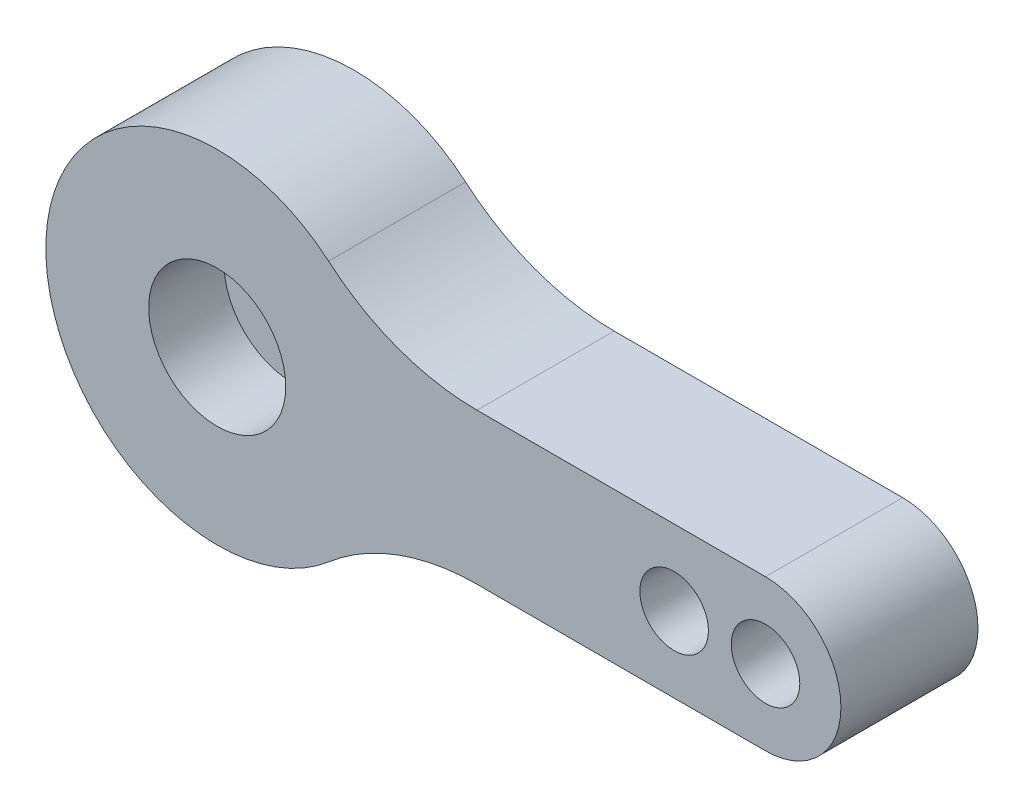
ISO-10303-21;
HEADER;
FILE_DESCRIPTION(('STEP AP214'),'2;1');
FILE_NAME('part.step','',(''),(''),'','','');
FILE_SCHEMA(('AUTOMOTIVE_DESIGN { 1 0 10303 214 1 1 1 1 }'));
ENDSEC;
DATA;
#1=APPLICATION_CONTEXT('core data for automotive mechanical design processes');
#2=APPLICATION_PROTOCOL_DEFINITION('international standard','automotive_design',2000,#1);
#3=PRODUCT_CONTEXT('',#1,'mechanical');
#4=PRODUCT('Part','Part','',(#3));
#5=PRODUCT_RELATED_PRODUCT_CATEGORY('part','',(#4));
#6=PRODUCT_DEFINITION_FORMATION('','',#4);
#7=PRODUCT_DEFINITION_CONTEXT('part definition',#1,'design');
#8=PRODUCT_DEFINITION('design','',#6,#7);
#9=PRODUCT_DEFINITION_SHAPE('','',#8);
#10=(LENGTH_UNIT() NAMED_UNIT(*) SI_UNIT(.MILLI.,.METRE.));
#11=(NAMED_UNIT(*) PLANE_ANGLE_UNIT() SI_UNIT($,.RADIAN.));
#12=(NAMED_UNIT(*) SI_UNIT($,.STERADIAN.) SOLID_ANGLE_UNIT());
#13=UNCERTAINTY_MEASURE_WITH_UNIT(LENGTH_MEASURE(1.E-05),#10,'distance_accuracy_value','');
#14=(GEOMETRIC_REPRESENTATION_CONTEXT(3) GLOBAL_UNCERTAINTY_ASSIGNED_CONTEXT((#13)) GLOBAL_UNIT_ASSIGNED_CONTEXT((#10,
#11,#12)) REPRESENTATION_CONTEXT('',''));
#15=CARTESIAN_POINT('',(0.,0.,0.));
#16=DIRECTION('',(0.,0.,1.));
#17=DIRECTION('',(1.,0.,0.));
#18=AXIS2_PLACEMENT_3D('',#15,#16,#17);
#19=CARTESIAN_POINT('',(0.,0.,6.));
#20=DIRECTION('',(0.,0.,-1.));
#21=DIRECTION('',(-1.,0.,0.));
#22=AXIS2_PLACEMENT_3D('',#19,#20,#21);
#23=CYLINDRICAL_SURFACE('',#22,1.5);
#24=CARTESIAN_POINT('',(0.,0.,0.));
#25=DIRECTION('',(0.,0.,1.));
#26=DIRECTION('',(1.,0.,0.));
#27=AXIS2_PLACEMENT_3D('',#24,#25,#26);
#28=CIRCLE('',#27,1.5);
#29=CARTESIAN_POINT('',(1.5,0.,0.));
#30=VERTEX_POINT('',#29);
#31=EDGE_CURVE('E255',#30,#30,#28,.T.);
#32=ORIENTED_EDGE('',*,*,#31,.F.);
#33=EDGE_LOOP('',(#32));
#34=FACE_BOUND('',#33,.T.);
#35=CARTESIAN_POINT('',(0.,0.,2.7));
#36=DIRECTION('',(0.,0.,1.));
#37=DIRECTION('',(1.,0.,0.));
#38=AXIS2_PLACEMENT_3D('',#35,#36,#37);
#39=CIRCLE('',#38,1.5);
#40=CARTESIAN_POINT('',(1.5,0.,2.7));
#41=VERTEX_POINT('',#40);
#42=EDGE_CURVE('E39',#41,#41,#39,.T.);
#43=ORIENTED_EDGE('',*,*,#42,.T.);
#44=EDGE_LOOP('',(#43));
#45=FACE_BOUND('',#44,.T.);
#46=ADVANCED_FACE('F35',(#34,#45),#23,.F.);
#47=CARTESIAN_POINT('',(24.,0.,6.));
#48=DIRECTION('',(0.,0.,1.));
#49=DIRECTION('',(1.,0.,0.));
#50=AXIS2_PLACEMENT_3D('',#47,#48,#49);
#51=PLANE('',#50);
#52=CARTESIAN_POINT('',(0.,0.,6.));
#53=DIRECTION('',(0.,0.,1.));
#54=DIRECTION('',(1.,0.,0.));
#55=AXIS2_PLACEMENT_3D('',#52,#53,#54);
#56=CIRCLE('',#55,3.);
#57=CARTESIAN_POINT('',(3.,0.,6.));
#58=VERTEX_POINT('',#57);
#59=EDGE_CURVE('E253',#58,#58,#56,.T.);
#60=ORIENTED_EDGE('',*,*,#59,.F.);
#61=EDGE_LOOP('',(#60));
#62=FACE_BOUND('',#61,.T.);
#63=CARTESIAN_POINT('',(20.,0.,6.));
#64=DIRECTION('',(0.,0.,1.));
#65=DIRECTION('',(1.,0.,0.));
#66=AXIS2_PLACEMENT_3D('',#63,#64,#65);
#67=CIRCLE('',#66,1.50000000000001);
#68=CARTESIAN_POINT('',(21.5,0.,6.));
#69=VERTEX_POINT('',#68);
#70=EDGE_CURVE('E262',#69,#69,#67,.T.);
#71=ORIENTED_EDGE('',*,*,#70,.F.);
#72=EDGE_LOOP('',(#71));
#73=FACE_BOUND('',#72,.T.);
#74=CARTESIAN_POINT('',(24.,0.,6.));
#75=DIRECTION('',(0.,0.,1.));
#76=DIRECTION('',(1.,0.,0.));
#77=AXIS2_PLACEMENT_3D('',#74,#75,#76);
#78=CIRCLE('',#77,3.3);
#79=CARTESIAN_POINT('',(24.,-3.3,6.));
#80=VERTEX_POINT('',#79);
#81=CARTESIAN_POINT('',(24.,3.3,6.));
#82=VERTEX_POINT('',#81);
#83=EDGE_CURVE('E133',#80,#82,#78,.T.);
#84=ORIENTED_EDGE('',*,*,#83,.T.);
#85=DIRECTION('',(-1.,0.,0.));
#86=VECTOR('',#85,1.);
#87=CARTESIAN_POINT('',(24.,3.3,6.));
#88=LINE('',#87,#86);
#89=CARTESIAN_POINT('',(11.3736537664903,3.3,6.));
#90=VERTEX_POINT('',#89);
#91=EDGE_CURVE('E90',#82,#90,#88,.T.);
#92=ORIENTED_EDGE('',*,*,#91,.T.);
#93=CARTESIAN_POINT('',(11.3736537664903,13.3,6.));
#94=DIRECTION('',(0.,0.,-1.));
#95=DIRECTION('',(1.,0.,0.));
#96=AXIS2_PLACEMENT_3D('',#93,#94,#95);
#97=CIRCLE('',#96,10.);
#98=CARTESIAN_POINT('',(4.87442304278157,5.7,6.));
#99=VERTEX_POINT('',#98);
#100=EDGE_CURVE('E104',#90,#99,#97,.T.);
#101=ORIENTED_EDGE('',*,*,#100,.T.);
#102=CARTESIAN_POINT('',(0.,0.,6.));
#103=DIRECTION('',(0.,0.,1.));
#104=DIRECTION('',(1.,0.,0.));
#105=AXIS2_PLACEMENT_3D('',#102,#103,#104);
#106=CIRCLE('',#105,7.5);
#107=CARTESIAN_POINT('',(4.87442304278157,-5.7,6.));
#108=VERTEX_POINT('',#107);
#109=EDGE_CURVE('E97',#99,#108,#106,.T.);
#110=ORIENTED_EDGE('',*,*,#109,.T.);
#111=CARTESIAN_POINT('',(11.3736537664903,-13.3,6.));
#112=DIRECTION('',(0.,0.,-1.));
#113=DIRECTION('',(-1.,0.,0.));
#114=AXIS2_PLACEMENT_3D('',#111,#112,#113);
#115=CIRCLE('',#114,10.);
#116=CARTESIAN_POINT('',(11.3736537664903,-3.3,6.));
#117=VERTEX_POINT('',#116);
#118=EDGE_CURVE('E102',#108,#117,#115,.T.);
#119=ORIENTED_EDGE('',*,*,#118,.T.);
#120=DIRECTION('',(1.,0.,0.));
#121=VECTOR('',#120,1.);
#122=CARTESIAN_POINT('',(24.,-3.3,6.));
#123=LINE('',#122,#121);
#124=EDGE_CURVE('E53',#117,#80,#123,.T.);
#125=ORIENTED_EDGE('',*,*,#124,.T.);
#126=EDGE_LOOP('',(#84,#92,#101,#110,#119,#125));
#127=FACE_BOUND('',#126,.T.);
#128=CARTESIAN_POINT('',(24.,0.,6.));
#129=DIRECTION('',(0.,0.,1.));
#130=DIRECTION('',(1.,0.,0.));
#131=AXIS2_PLACEMENT_3D('',#128,#129,#130);
#132=CIRCLE('',#131,1.5);
#133=CARTESIAN_POINT('',(25.5,0.,6.));
#134=VERTEX_POINT('',#133);
#135=EDGE_CURVE('E126',#134,#134,#132,.T.);
#136=ORIENTED_EDGE('',*,*,#135,.F.);
#137=EDGE_LOOP('',(#136));
#138=FACE_BOUND('',#137,.T.);
#139=ADVANCED_FACE('F99',(#62,#73,#127,#138),#51,.T.);
#140=CARTESIAN_POINT('',(24.,0.,0.));
#141=DIRECTION('',(0.,0.,1.));
#142=DIRECTION('',(1.,0.,0.));
#143=AXIS2_PLACEMENT_3D('',#140,#141,#142);
#144=PLANE('',#143);
#145=CARTESIAN_POINT('',(24.,0.,0.));
#146=DIRECTION('',(0.,0.,1.));
#147=DIRECTION('',(1.,0.,0.));
#148=AXIS2_PLACEMENT_3D('',#145,#146,#147);
#149=CIRCLE('',#148,3.3);
#150=CARTESIAN_POINT('',(24.,-3.3,0.));
#151=VERTEX_POINT('',#150);
#152=CARTESIAN_POINT('',(24.,3.3,0.));
#153=VERTEX_POINT('',#152);
#154=EDGE_CURVE('E122',#151,#153,#149,.T.);
#155=ORIENTED_EDGE('',*,*,#154,.F.);
#156=DIRECTION('',(1.,0.,0.));
#157=VECTOR('',#156,1.);
#158=CARTESIAN_POINT('',(24.,-3.3,0.));
#159=LINE('',#158,#157);
#160=CARTESIAN_POINT('',(11.3736537664903,-3.3,0.));
#161=VERTEX_POINT('',#160);
#162=EDGE_CURVE('E82',#161,#151,#159,.T.);
#163=ORIENTED_EDGE('',*,*,#162,.F.);
#164=CARTESIAN_POINT('',(11.3736537664903,-13.3,0.));
#165=DIRECTION('',(0.,0.,-1.));
#166=DIRECTION('',(-1.,0.,0.));
#167=AXIS2_PLACEMENT_3D('',#164,#165,#166);
#168=CIRCLE('',#167,10.);
#169=CARTESIAN_POINT('',(4.87442304278157,-5.7,0.));
#170=VERTEX_POINT('',#169);
#171=EDGE_CURVE('E76',#170,#161,#168,.T.);
#172=ORIENTED_EDGE('',*,*,#171,.F.);
#173=CARTESIAN_POINT('',(0.,0.,0.));
#174=DIRECTION('',(0.,0.,1.));
#175=DIRECTION('',(1.,0.,0.));
#176=AXIS2_PLACEMENT_3D('',#173,#174,#175);
#177=CIRCLE('',#176,7.5);
#178=CARTESIAN_POINT('',(4.87442304278157,5.7,0.));
#179=VERTEX_POINT('',#178);
#180=EDGE_CURVE('E112',#179,#170,#177,.T.);
#181=ORIENTED_EDGE('',*,*,#180,.F.);
#182=CARTESIAN_POINT('',(11.3736537664903,13.3,0.));
#183=DIRECTION('',(0.,0.,-1.));
#184=DIRECTION('',(1.,0.,0.));
#185=AXIS2_PLACEMENT_3D('',#182,#183,#184);
#186=CIRCLE('',#185,10.);
#187=CARTESIAN_POINT('',(11.3736537664903,3.3,0.));
#188=VERTEX_POINT('',#187);
#189=EDGE_CURVE('E128',#188,#179,#186,.T.);
#190=ORIENTED_EDGE('',*,*,#189,.F.);
#191=DIRECTION('',(-1.,0.,0.));
#192=VECTOR('',#191,1.);
#193=CARTESIAN_POINT('',(24.,3.3,0.));
#194=LINE('',#193,#192);
#195=EDGE_CURVE('E125',#153,#188,#194,.T.);
#196=ORIENTED_EDGE('',*,*,#195,.F.);
#197=EDGE_LOOP('',(#155,#163,#172,#181,#190,#196));
#198=FACE_BOUND('',#197,.T.);
#199=CARTESIAN_POINT('',(24.,0.,0.));
#200=DIRECTION('',(0.,0.,1.));
#201=DIRECTION('',(1.,0.,0.));
#202=AXIS2_PLACEMENT_3D('',#199,#200,#201);
#203=CIRCLE('',#202,1.5);
#204=CARTESIAN_POINT('',(25.5,0.,0.));
#205=VERTEX_POINT('',#204);
#206=EDGE_CURVE('E265',#205,#205,#203,.T.);
#207=ORIENTED_EDGE('',*,*,#206,.T.);
#208=EDGE_LOOP('',(#207));
#209=FACE_BOUND('',#208,.T.);
#210=CARTESIAN_POINT('',(20.,0.,0.));
#211=DIRECTION('',(0.,0.,1.));
#212=DIRECTION('',(1.,0.,0.));
#213=AXIS2_PLACEMENT_3D('',#210,#211,#212);
#214=CIRCLE('',#213,1.50000000000001);
#215=CARTESIAN_POINT('',(21.5,0.,0.));
#216=VERTEX_POINT('',#215);
#217=EDGE_CURVE('E261',#216,#216,#214,.T.);
#218=ORIENTED_EDGE('',*,*,#217,.T.);
#219=EDGE_LOOP('',(#218));
#220=FACE_BOUND('',#219,.T.);
#221=ORIENTED_EDGE('',*,*,#31,.T.);
#222=EDGE_LOOP('',(#221));
#223=FACE_BOUND('',#222,.T.);
#224=ADVANCED_FACE('F143',(#198,#209,#220,#223),#144,.F.);
#225=CARTESIAN_POINT('',(24.,0.,6.));
#226=DIRECTION('',(0.,0.,-1.));
#227=DIRECTION('',(-1.,0.,0.));
#228=AXIS2_PLACEMENT_3D('',#225,#226,#227);
#229=CYLINDRICAL_SURFACE('',#228,3.3);
#230=ORIENTED_EDGE('',*,*,#154,.T.);
#231=DIRECTION('',(0.,0.,-1.));
#232=VECTOR('',#231,1.);
#233=CARTESIAN_POINT('',(24.,3.3,6.));
#234=LINE('',#233,#232);
#235=EDGE_CURVE('E11',#82,#153,#234,.T.);
#236=ORIENTED_EDGE('',*,*,#235,.F.);
#237=ORIENTED_EDGE('',*,*,#83,.F.);
#238=DIRECTION('',(0.,0.,-1.));
#239=VECTOR('',#238,1.);
#240=CARTESIAN_POINT('',(24.,-3.3,6.));
#241=LINE('',#240,#239);
#242=EDGE_CURVE('E118',#80,#151,#241,.T.);
#243=ORIENTED_EDGE('',*,*,#242,.T.);
#244=EDGE_LOOP('',(#230,#236,#237,#243));
#245=FACE_BOUND('',#244,.T.);
#246=ADVANCED_FACE('F37',(#245),#229,.T.);
#247=CARTESIAN_POINT('',(24.,3.3,6.));
#248=DIRECTION('',(0.,-1.,0.));
#249=DIRECTION('',(1.,0.,0.));
#250=AXIS2_PLACEMENT_3D('',#247,#248,#249);
#251=PLANE('',#250);
#252=ORIENTED_EDGE('',*,*,#195,.T.);
#253=DIRECTION('',(0.,0.,-1.));
#254=VECTOR('',#253,1.);
#255=CARTESIAN_POINT('',(11.3736537664903,3.3,6.));
#256=LINE('',#255,#254);
#257=EDGE_CURVE('E45',#90,#188,#256,.T.);
#258=ORIENTED_EDGE('',*,*,#257,.F.);
#259=ORIENTED_EDGE('',*,*,#91,.F.);
#260=ORIENTED_EDGE('',*,*,#235,.T.);
#261=EDGE_LOOP('',(#252,#258,#259,#260));
#262=FACE_BOUND('',#261,.T.);
#263=ADVANCED_FACE('F181',(#262),#251,.F.);
#264=CARTESIAN_POINT('',(11.3736537664903,13.3,6.));
#265=DIRECTION('',(0.,0.,-1.));
#266=DIRECTION('',(-1.,0.,0.));
#267=AXIS2_PLACEMENT_3D('',#264,#265,#266);
#268=CYLINDRICAL_SURFACE('',#267,10.);
#269=ORIENTED_EDGE('',*,*,#189,.T.);
#270=DIRECTION('',(0.,0.,-1.));
#271=VECTOR('',#270,1.);
#272=CARTESIAN_POINT('',(4.87442304278157,5.7,6.));
#273=LINE('',#272,#271);
#274=EDGE_CURVE('E113',#99,#179,#273,.T.);
#275=ORIENTED_EDGE('',*,*,#274,.F.);
#276=ORIENTED_EDGE('',*,*,#100,.F.);
#277=ORIENTED_EDGE('',*,*,#257,.T.);
#278=EDGE_LOOP('',(#269,#275,#276,#277));
#279=FACE_BOUND('',#278,.T.);
#280=ADVANCED_FACE('F140',(#279),#268,.F.);
#281=CARTESIAN_POINT('',(0.,0.,6.));
#282=DIRECTION('',(0.,0.,-1.));
#283=DIRECTION('',(-1.,0.,0.));
#284=AXIS2_PLACEMENT_3D('',#281,#282,#283);
#285=CYLINDRICAL_SURFACE('',#284,7.5);
#286=ORIENTED_EDGE('',*,*,#180,.T.);
#287=DIRECTION('',(0.,0.,-1.));
#288=VECTOR('',#287,1.);
#289=CARTESIAN_POINT('',(4.87442304278157,-5.7,6.));
#290=LINE('',#289,#288);
#291=EDGE_CURVE('E109',#108,#170,#290,.T.);
#292=ORIENTED_EDGE('',*,*,#291,.F.);
#293=ORIENTED_EDGE('',*,*,#109,.F.);
#294=ORIENTED_EDGE('',*,*,#274,.T.);
#295=EDGE_LOOP('',(#286,#292,#293,#294));
#296=FACE_BOUND('',#295,.T.);
#297=ADVANCED_FACE('F110',(#296),#285,.T.);
#298=CARTESIAN_POINT('',(11.3736537664903,-13.3,6.));
#299=DIRECTION('',(0.,0.,-1.));
#300=DIRECTION('',(-1.,0.,0.));
#301=AXIS2_PLACEMENT_3D('',#298,#299,#300);
#302=CYLINDRICAL_SURFACE('',#301,10.);
#303=ORIENTED_EDGE('',*,*,#171,.T.);
#304=DIRECTION('',(0.,0.,-1.));
#305=VECTOR('',#304,1.);
#306=CARTESIAN_POINT('',(11.3736537664903,-3.3,6.));
#307=LINE('',#306,#305);
#308=EDGE_CURVE('E114',#117,#161,#307,.T.);
#309=ORIENTED_EDGE('',*,*,#308,.F.);
#310=ORIENTED_EDGE('',*,*,#118,.F.);
#311=ORIENTED_EDGE('',*,*,#291,.T.);
#312=EDGE_LOOP('',(#303,#309,#310,#311));
#313=FACE_BOUND('',#312,.T.);
#314=ADVANCED_FACE('F116',(#313),#302,.F.);
#315=CARTESIAN_POINT('',(24.,-3.3,6.));
#316=DIRECTION('',(0.,1.,0.));
#317=DIRECTION('',(-1.,0.,0.));
#318=AXIS2_PLACEMENT_3D('',#315,#316,#317);
#319=PLANE('',#318);
#320=ORIENTED_EDGE('',*,*,#162,.T.);
#321=ORIENTED_EDGE('',*,*,#242,.F.);
#322=ORIENTED_EDGE('',*,*,#124,.F.);
#323=ORIENTED_EDGE('',*,*,#308,.T.);
#324=EDGE_LOOP('',(#320,#321,#322,#323));
#325=FACE_BOUND('',#324,.T.);
#326=ADVANCED_FACE('F148',(#325),#319,.F.);
#327=CARTESIAN_POINT('',(24.,0.,6.));
#328=DIRECTION('',(0.,0.,-1.));
#329=DIRECTION('',(-1.,0.,0.));
#330=AXIS2_PLACEMENT_3D('',#327,#328,#329);
#331=CYLINDRICAL_SURFACE('',#330,1.5);
#332=ORIENTED_EDGE('',*,*,#135,.T.);
#333=EDGE_LOOP('',(#332));
#334=FACE_BOUND('',#333,.T.);
#335=ORIENTED_EDGE('',*,*,#206,.F.);
#336=EDGE_LOOP('',(#335));
#337=FACE_BOUND('',#336,.T.);
#338=ADVANCED_FACE('F150',(#334,#337),#331,.F.);
#339=CARTESIAN_POINT('',(20.,0.,6.));
#340=DIRECTION('',(0.,0.,-1.));
#341=DIRECTION('',(-1.,0.,0.));
#342=AXIS2_PLACEMENT_3D('',#339,#340,#341);
#343=CYLINDRICAL_SURFACE('',#342,1.50000000000001);
#344=ORIENTED_EDGE('',*,*,#70,.T.);
#345=EDGE_LOOP('',(#344));
#346=FACE_BOUND('',#345,.T.);
#347=ORIENTED_EDGE('',*,*,#217,.F.);
#348=EDGE_LOOP('',(#347));
#349=FACE_BOUND('',#348,.T.);
#350=ADVANCED_FACE('F156',(#346,#349),#343,.F.);
#351=CARTESIAN_POINT('',(0.,0.,2.7));
#352=DIRECTION('',(0.,0.,1.));
#353=DIRECTION('',(1.,0.,0.));
#354=AXIS2_PLACEMENT_3D('',#351,#352,#353);
#355=CYLINDRICAL_SURFACE('',#354,3.);
#356=CARTESIAN_POINT('',(0.,0.,2.7));
#357=DIRECTION('',(0.,0.,1.));
#358=DIRECTION('',(1.,0.,0.));
#359=AXIS2_PLACEMENT_3D('',#356,#357,#358);
#360=CIRCLE('',#359,3.);
#361=CARTESIAN_POINT('',(3.,0.,2.7));
#362=VERTEX_POINT('',#361);
#363=EDGE_CURVE('E252',#362,#362,#360,.T.);
#364=ORIENTED_EDGE('',*,*,#363,.F.);
#365=EDGE_LOOP('',(#364));
#366=FACE_BOUND('',#365,.T.);
#367=ORIENTED_EDGE('',*,*,#59,.T.);
#368=EDGE_LOOP('',(#367));
#369=FACE_BOUND('',#368,.T.);
#370=ADVANCED_FACE('F173',(#366,#369),#355,.F.);
#371=CARTESIAN_POINT('',(0.,0.,2.7));
#372=DIRECTION('',(0.,0.,1.));
#373=DIRECTION('',(1.,0.,0.));
#374=AXIS2_PLACEMENT_3D('',#371,#372,#373);
#375=PLANE('',#374);
#376=ORIENTED_EDGE('',*,*,#42,.F.);
#377=EDGE_LOOP('',(#376));
#378=FACE_BOUND('',#377,.T.);
#379=ORIENTED_EDGE('',*,*,#363,.T.);
#380=EDGE_LOOP('',(#379));
#381=FACE_BOUND('',#380,.T.);
#382=ADVANCED_FACE('F235',(#378,#381),#375,.T.);
#383=CLOSED_SHELL('',(#46,#139,#224,#246,#263,#280,#297,#314,#326,#338,#350,#370,#382));
#384=MANIFOLD_SOLID_BREP('B2',#383);
#385=ADVANCED_BREP_SHAPE_REPRESENTATION('',(#18,#384),#14);
#386=SHAPE_DEFINITION_REPRESENTATION(#9,#385);
ENDSEC;
END-ISO-10303-21;
